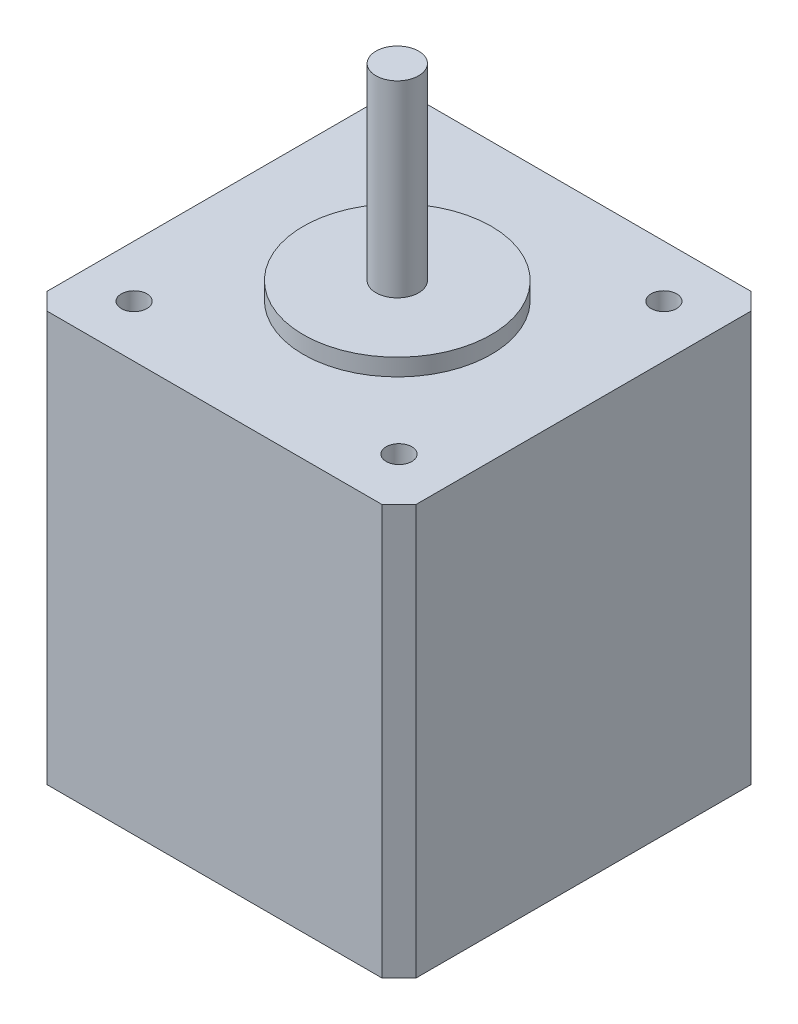
ISO-10303-21;
HEADER;
FILE_DESCRIPTION(('STEP AP214'),'2;1');
FILE_NAME('part.step','',(''),(''),'','','');
FILE_SCHEMA(('AUTOMOTIVE_DESIGN { 1 0 10303 214 1 1 1 1 }'));
ENDSEC;
DATA;
#1=APPLICATION_CONTEXT('core data for automotive mechanical design processes');
#2=APPLICATION_PROTOCOL_DEFINITION('international standard','automotive_design',2000,#1);
#3=PRODUCT_CONTEXT('',#1,'mechanical');
#4=PRODUCT('Part','Part','',(#3));
#5=PRODUCT_RELATED_PRODUCT_CATEGORY('part','',(#4));
#6=PRODUCT_DEFINITION_FORMATION('','',#4);
#7=PRODUCT_DEFINITION_CONTEXT('part definition',#1,'design');
#8=PRODUCT_DEFINITION('design','',#6,#7);
#9=PRODUCT_DEFINITION_SHAPE('','',#8);
#10=(LENGTH_UNIT() NAMED_UNIT(*) SI_UNIT(.MILLI.,.METRE.));
#11=(NAMED_UNIT(*) PLANE_ANGLE_UNIT() SI_UNIT($,.RADIAN.));
#12=(NAMED_UNIT(*) SI_UNIT($,.STERADIAN.) SOLID_ANGLE_UNIT());
#13=UNCERTAINTY_MEASURE_WITH_UNIT(LENGTH_MEASURE(1.E-05),#10,'distance_accuracy_value','');
#14=(GEOMETRIC_REPRESENTATION_CONTEXT(3) GLOBAL_UNCERTAINTY_ASSIGNED_CONTEXT((#13)) GLOBAL_UNIT_ASSIGNED_CONTEXT((#10,
#11,#12)) REPRESENTATION_CONTEXT('',''));
#15=CARTESIAN_POINT('',(0.,0.,0.));
#16=DIRECTION('',(0.,0.,1.));
#17=DIRECTION('',(1.,0.,0.));
#18=AXIS2_PLACEMENT_3D('',#15,#16,#17);
#19=CARTESIAN_POINT('',(21.4,50.,-21.6));
#20=DIRECTION('',(0.,1.,0.));
#21=DIRECTION('',(0.,0.,1.));
#22=AXIS2_PLACEMENT_3D('',#19,#20,#21);
#23=PLANE('',#22);
#24=CARTESIAN_POINT('',(21.4,50.,-21.6));
#25=DIRECTION('',(0.,1.,0.));
#26=DIRECTION('',(0.,0.,1.));
#27=AXIS2_PLACEMENT_3D('',#24,#25,#26);
#28=CIRCLE('',#27,11.);
#29=CARTESIAN_POINT('',(21.4,50.,-10.6));
#30=VERTEX_POINT('',#29);
#31=EDGE_CURVE('E209',#30,#30,#28,.T.);
#32=ORIENTED_EDGE('',*,*,#31,.T.);
#33=EDGE_LOOP('',(#32));
#34=FACE_BOUND('',#33,.T.);
#35=CARTESIAN_POINT('',(21.4,50.,-21.6));
#36=DIRECTION('',(0.,1.,0.));
#37=DIRECTION('',(0.,0.,1.));
#38=AXIS2_PLACEMENT_3D('',#35,#36,#37);
#39=CIRCLE('',#38,2.5);
#40=CARTESIAN_POINT('',(21.4,50.,-19.1));
#41=VERTEX_POINT('',#40);
#42=EDGE_CURVE('E36',#41,#41,#39,.F.);
#43=ORIENTED_EDGE('',*,*,#42,.T.);
#44=EDGE_LOOP('',(#43));
#45=FACE_BOUND('',#44,.T.);
#46=ADVANCED_FACE('F32',(#34,#45),#23,.T.);
#47=CARTESIAN_POINT('',(0.,48.,0.));
#48=DIRECTION('',(0.,-1.,0.));
#49=DIRECTION('',(0.,0.,-1.));
#50=AXIS2_PLACEMENT_3D('',#47,#48,#49);
#51=PLANE('',#50);
#52=CARTESIAN_POINT('',(6.10000000000033,48.,-6.1));
#53=DIRECTION('',(0.,1.,0.));
#54=DIRECTION('',(0.,0.,1.));
#55=AXIS2_PLACEMENT_3D('',#52,#53,#54);
#56=CIRCLE('',#55,1.5);
#57=CARTESIAN_POINT('',(6.10000000000033,48.,-4.6));
#58=VERTEX_POINT('',#57);
#59=EDGE_CURVE('E203',#58,#58,#56,.T.);
#60=ORIENTED_EDGE('',*,*,#59,.F.);
#61=EDGE_LOOP('',(#60));
#62=FACE_BOUND('',#61,.T.);
#63=CARTESIAN_POINT('',(37.1,48.,-37.1));
#64=DIRECTION('',(0.,1.,0.));
#65=DIRECTION('',(0.,0.,1.));
#66=AXIS2_PLACEMENT_3D('',#63,#64,#65);
#67=CIRCLE('',#66,1.5);
#68=CARTESIAN_POINT('',(37.1,48.,-35.6));
#69=VERTEX_POINT('',#68);
#70=EDGE_CURVE('E192',#69,#69,#67,.T.);
#71=ORIENTED_EDGE('',*,*,#70,.F.);
#72=EDGE_LOOP('',(#71));
#73=FACE_BOUND('',#72,.T.);
#74=DIRECTION('',(-1.,0.,0.));
#75=VECTOR('',#74,1.);
#76=CARTESIAN_POINT('',(0.,48.,-43.2));
#77=LINE('',#76,#75);
#78=CARTESIAN_POINT('',(41.2,48.,-43.2));
#79=VERTEX_POINT('',#78);
#80=CARTESIAN_POINT('',(2.00000000000001,48.,-43.2));
#81=VERTEX_POINT('',#80);
#82=EDGE_CURVE('E137',#79,#81,#77,.T.);
#83=ORIENTED_EDGE('',*,*,#82,.T.);
#84=DIRECTION('',(0.70710678118655,0.,-0.707106781186545));
#85=VECTOR('',#84,1.);
#86=CARTESIAN_POINT('',(0.,48.,-41.2));
#87=LINE('',#86,#85);
#88=CARTESIAN_POINT('',(0.,48.,-41.2));
#89=VERTEX_POINT('',#88);
#90=EDGE_CURVE('E156',#81,#89,#87,.F.);
#91=ORIENTED_EDGE('',*,*,#90,.T.);
#92=DIRECTION('',(0.,0.,1.));
#93=VECTOR('',#92,1.);
#94=CARTESIAN_POINT('',(0.,48.,0.));
#95=LINE('',#94,#93);
#96=CARTESIAN_POINT('',(0.,48.,-2.00000000000001));
#97=VERTEX_POINT('',#96);
#98=EDGE_CURVE('E120',#89,#97,#95,.T.);
#99=ORIENTED_EDGE('',*,*,#98,.T.);
#100=DIRECTION('',(-0.707106781186545,0.,-0.70710678118655));
#101=VECTOR('',#100,1.);
#102=CARTESIAN_POINT('',(1.99999999999999,48.,0.));
#103=LINE('',#102,#101);
#104=CARTESIAN_POINT('',(1.99999999999999,48.,0.));
#105=VERTEX_POINT('',#104);
#106=EDGE_CURVE('E151',#97,#105,#103,.F.);
#107=ORIENTED_EDGE('',*,*,#106,.T.);
#108=DIRECTION('',(1.,0.,0.));
#109=VECTOR('',#108,1.);
#110=CARTESIAN_POINT('',(0.,48.,0.));
#111=LINE('',#110,#109);
#112=CARTESIAN_POINT('',(41.2,48.,0.));
#113=VERTEX_POINT('',#112);
#114=EDGE_CURVE('E169',#105,#113,#111,.T.);
#115=ORIENTED_EDGE('',*,*,#114,.T.);
#116=DIRECTION('',(-0.70710678118655,0.,0.707106781186545));
#117=VECTOR('',#116,1.);
#118=CARTESIAN_POINT('',(43.2,48.,-1.99999999999999));
#119=LINE('',#118,#117);
#120=CARTESIAN_POINT('',(43.2,48.,-1.99999999999999));
#121=VERTEX_POINT('',#120);
#122=EDGE_CURVE('E55',#113,#121,#119,.F.);
#123=ORIENTED_EDGE('',*,*,#122,.T.);
#124=DIRECTION('',(0.,0.,-1.));
#125=VECTOR('',#124,1.);
#126=CARTESIAN_POINT('',(43.2,48.,0.));
#127=LINE('',#126,#125);
#128=CARTESIAN_POINT('',(43.2,48.,-41.2));
#129=VERTEX_POINT('',#128);
#130=EDGE_CURVE('E176',#121,#129,#127,.T.);
#131=ORIENTED_EDGE('',*,*,#130,.T.);
#132=DIRECTION('',(0.707106781186545,0.,0.70710678118655));
#133=VECTOR('',#132,1.);
#134=CARTESIAN_POINT('',(41.2,48.,-43.2));
#135=LINE('',#134,#133);
#136=EDGE_CURVE('E154',#129,#79,#135,.F.);
#137=ORIENTED_EDGE('',*,*,#136,.T.);
#138=EDGE_LOOP('',(#83,#91,#99,#107,#115,#123,#131,#137));
#139=FACE_BOUND('',#138,.T.);
#140=CARTESIAN_POINT('',(6.1,48.,-37.1));
#141=DIRECTION('',(0.,1.,0.));
#142=DIRECTION('',(0.,0.,1.));
#143=AXIS2_PLACEMENT_3D('',#140,#141,#142);
#144=CIRCLE('',#143,1.5);
#145=CARTESIAN_POINT('',(6.1,48.,-35.6));
#146=VERTEX_POINT('',#145);
#147=EDGE_CURVE('E128',#146,#146,#144,.T.);
#148=ORIENTED_EDGE('',*,*,#147,.F.);
#149=EDGE_LOOP('',(#148));
#150=FACE_BOUND('',#149,.T.);
#151=CARTESIAN_POINT('',(37.1000000000003,48.,-6.1));
#152=DIRECTION('',(0.,1.,0.));
#153=DIRECTION('',(0.,0.,1.));
#154=AXIS2_PLACEMENT_3D('',#151,#152,#153);
#155=CIRCLE('',#154,1.5);
#156=CARTESIAN_POINT('',(37.1000000000003,48.,-4.6));
#157=VERTEX_POINT('',#156);
#158=EDGE_CURVE('E197',#157,#157,#155,.T.);
#159=ORIENTED_EDGE('',*,*,#158,.F.);
#160=EDGE_LOOP('',(#159));
#161=FACE_BOUND('',#160,.T.);
#162=CARTESIAN_POINT('',(21.4,48.,-21.6));
#163=DIRECTION('',(0.,-1.,0.));
#164=DIRECTION('',(0.,0.,-1.));
#165=AXIS2_PLACEMENT_3D('',#162,#163,#164);
#166=CIRCLE('',#165,11.);
#167=CARTESIAN_POINT('',(21.4,48.,-32.6));
#168=VERTEX_POINT('',#167);
#169=EDGE_CURVE('E11',#168,#168,#166,.F.);
#170=ORIENTED_EDGE('',*,*,#169,.F.);
#171=EDGE_LOOP('',(#170));
#172=FACE_BOUND('',#171,.T.);
#173=ADVANCED_FACE('F173',(#62,#73,#139,#150,#161,#172),#51,.F.);
#174=CARTESIAN_POINT('',(0.,0.,0.));
#175=DIRECTION('',(0.,-1.,0.));
#176=DIRECTION('',(0.,0.,-1.));
#177=AXIS2_PLACEMENT_3D('',#174,#175,#176);
#178=PLANE('',#177);
#179=CARTESIAN_POINT('',(37.1000000000003,0.,-6.1));
#180=DIRECTION('',(0.,1.,0.));
#181=DIRECTION('',(0.,0.,1.));
#182=AXIS2_PLACEMENT_3D('',#179,#180,#181);
#183=CIRCLE('',#182,1.5);
#184=CARTESIAN_POINT('',(37.1000000000003,0.,-4.6));
#185=VERTEX_POINT('',#184);
#186=EDGE_CURVE('E200',#185,#185,#183,.T.);
#187=ORIENTED_EDGE('',*,*,#186,.T.);
#188=EDGE_LOOP('',(#187));
#189=FACE_BOUND('',#188,.T.);
#190=CARTESIAN_POINT('',(6.1,0.,-37.1));
#191=DIRECTION('',(0.,1.,0.));
#192=DIRECTION('',(0.,0.,1.));
#193=AXIS2_PLACEMENT_3D('',#190,#191,#192);
#194=CIRCLE('',#193,1.5);
#195=CARTESIAN_POINT('',(6.1,0.,-35.6));
#196=VERTEX_POINT('',#195);
#197=EDGE_CURVE('E134',#196,#196,#194,.T.);
#198=ORIENTED_EDGE('',*,*,#197,.T.);
#199=EDGE_LOOP('',(#198));
#200=FACE_BOUND('',#199,.T.);
#201=DIRECTION('',(0.,0.,1.));
#202=VECTOR('',#201,1.);
#203=CARTESIAN_POINT('',(0.,0.,0.));
#204=LINE('',#203,#202);
#205=CARTESIAN_POINT('',(0.,0.,-41.2));
#206=VERTEX_POINT('',#205);
#207=CARTESIAN_POINT('',(0.,0.,-2.00000000000001));
#208=VERTEX_POINT('',#207);
#209=EDGE_CURVE('E117',#206,#208,#204,.T.);
#210=ORIENTED_EDGE('',*,*,#209,.F.);
#211=DIRECTION('',(-0.70710678118655,0.,0.707106781186545));
#212=VECTOR('',#211,1.);
#213=CARTESIAN_POINT('',(-20.6,0.,-20.6000000000001));
#214=LINE('',#213,#212);
#215=CARTESIAN_POINT('',(2.00000000000001,0.,-43.2));
#216=VERTEX_POINT('',#215);
#217=EDGE_CURVE('E100',#206,#216,#214,.F.);
#218=ORIENTED_EDGE('',*,*,#217,.T.);
#219=DIRECTION('',(-1.,0.,0.));
#220=VECTOR('',#219,1.);
#221=CARTESIAN_POINT('',(0.,0.,-43.2));
#222=LINE('',#221,#220);
#223=CARTESIAN_POINT('',(41.2,0.,-43.2));
#224=VERTEX_POINT('',#223);
#225=EDGE_CURVE('E141',#224,#216,#222,.T.);
#226=ORIENTED_EDGE('',*,*,#225,.F.);
#227=DIRECTION('',(-0.707106781186545,0.,-0.70710678118655));
#228=VECTOR('',#227,1.);
#229=CARTESIAN_POINT('',(42.2000000000001,0.,-42.1999999999998));
#230=LINE('',#229,#228);
#231=CARTESIAN_POINT('',(43.2,0.,-41.2));
#232=VERTEX_POINT('',#231);
#233=EDGE_CURVE('E111',#224,#232,#230,.F.);
#234=ORIENTED_EDGE('',*,*,#233,.T.);
#235=DIRECTION('',(0.,0.,-1.));
#236=VECTOR('',#235,1.);
#237=CARTESIAN_POINT('',(43.2,0.,0.));
#238=LINE('',#237,#236);
#239=CARTESIAN_POINT('',(43.2,0.,-2.));
#240=VERTEX_POINT('',#239);
#241=EDGE_CURVE('E131',#240,#232,#238,.T.);
#242=ORIENTED_EDGE('',*,*,#241,.F.);
#243=DIRECTION('',(0.70710678118655,0.,-0.707106781186545));
#244=VECTOR('',#243,1.);
#245=CARTESIAN_POINT('',(20.5999999999999,0.,20.6));
#246=LINE('',#245,#244);
#247=CARTESIAN_POINT('',(41.2,0.,0.));
#248=VERTEX_POINT('',#247);
#249=EDGE_CURVE('E145',#240,#248,#246,.F.);
#250=ORIENTED_EDGE('',*,*,#249,.T.);
#251=DIRECTION('',(1.,0.,0.));
#252=VECTOR('',#251,1.);
#253=CARTESIAN_POINT('',(0.,0.,0.));
#254=LINE('',#253,#252);
#255=CARTESIAN_POINT('',(1.99999999999999,0.,0.));
#256=VERTEX_POINT('',#255);
#257=EDGE_CURVE('E127',#256,#248,#254,.T.);
#258=ORIENTED_EDGE('',*,*,#257,.F.);
#259=DIRECTION('',(0.707106781186545,0.,0.70710678118655));
#260=VECTOR('',#259,1.);
#261=CARTESIAN_POINT('',(1.,0.,-0.999999999999997));
#262=LINE('',#261,#260);
#263=EDGE_CURVE('E121',#256,#208,#262,.F.);
#264=ORIENTED_EDGE('',*,*,#263,.T.);
#265=EDGE_LOOP('',(#210,#218,#226,#234,#242,#250,#258,#264));
#266=FACE_BOUND('',#265,.T.);
#267=CARTESIAN_POINT('',(37.1,0.,-37.1));
#268=DIRECTION('',(0.,1.,0.));
#269=DIRECTION('',(0.,0.,1.));
#270=AXIS2_PLACEMENT_3D('',#267,#268,#269);
#271=CIRCLE('',#270,1.5);
#272=CARTESIAN_POINT('',(37.1,0.,-35.6));
#273=VERTEX_POINT('',#272);
#274=EDGE_CURVE('E194',#273,#273,#271,.T.);
#275=ORIENTED_EDGE('',*,*,#274,.T.);
#276=EDGE_LOOP('',(#275));
#277=FACE_BOUND('',#276,.T.);
#278=CARTESIAN_POINT('',(6.10000000000033,0.,-6.1));
#279=DIRECTION('',(0.,1.,0.));
#280=DIRECTION('',(0.,0.,1.));
#281=AXIS2_PLACEMENT_3D('',#278,#279,#280);
#282=CIRCLE('',#281,1.5);
#283=CARTESIAN_POINT('',(6.10000000000033,0.,-4.6));
#284=VERTEX_POINT('',#283);
#285=EDGE_CURVE('E206',#284,#284,#282,.T.);
#286=ORIENTED_EDGE('',*,*,#285,.T.);
#287=EDGE_LOOP('',(#286));
#288=FACE_BOUND('',#287,.T.);
#289=ADVANCED_FACE('F124',(#189,#200,#266,#277,#288),#178,.T.);
#290=CARTESIAN_POINT('',(0.,48.,0.));
#291=DIRECTION('',(1.,0.,0.));
#292=DIRECTION('',(0.,0.,-1.));
#293=AXIS2_PLACEMENT_3D('',#290,#291,#292);
#294=PLANE('',#293);
#295=ORIENTED_EDGE('',*,*,#98,.F.);
#296=DIRECTION('',(0.,-1.,0.));
#297=VECTOR('',#296,1.);
#298=CARTESIAN_POINT('',(0.,48.,-41.2));
#299=LINE('',#298,#297);
#300=EDGE_CURVE('E104',#89,#206,#299,.T.);
#301=ORIENTED_EDGE('',*,*,#300,.T.);
#302=ORIENTED_EDGE('',*,*,#209,.T.);
#303=DIRECTION('',(0.,1.,0.));
#304=VECTOR('',#303,1.);
#305=CARTESIAN_POINT('',(0.,48.,-2.00000000000001));
#306=LINE('',#305,#304);
#307=EDGE_CURVE('E122',#208,#97,#306,.T.);
#308=ORIENTED_EDGE('',*,*,#307,.T.);
#309=EDGE_LOOP('',(#295,#301,#302,#308));
#310=FACE_BOUND('',#309,.T.);
#311=ADVANCED_FACE('F116',(#310),#294,.F.);
#312=CARTESIAN_POINT('',(0.,48.,0.));
#313=DIRECTION('',(0.,0.,-1.));
#314=DIRECTION('',(-1.,0.,0.));
#315=AXIS2_PLACEMENT_3D('',#312,#313,#314);
#316=PLANE('',#315);
#317=ORIENTED_EDGE('',*,*,#257,.T.);
#318=DIRECTION('',(0.,1.,0.));
#319=VECTOR('',#318,1.);
#320=CARTESIAN_POINT('',(41.2,48.,0.));
#321=LINE('',#320,#319);
#322=EDGE_CURVE('E41',#248,#113,#321,.T.);
#323=ORIENTED_EDGE('',*,*,#322,.T.);
#324=ORIENTED_EDGE('',*,*,#114,.F.);
#325=DIRECTION('',(0.,-1.,0.));
#326=VECTOR('',#325,1.);
#327=CARTESIAN_POINT('',(1.99999999999999,48.,0.));
#328=LINE('',#327,#326);
#329=EDGE_CURVE('E162',#105,#256,#328,.T.);
#330=ORIENTED_EDGE('',*,*,#329,.T.);
#331=EDGE_LOOP('',(#317,#323,#324,#330));
#332=FACE_BOUND('',#331,.T.);
#333=ADVANCED_FACE('F168',(#332),#316,.F.);
#334=CARTESIAN_POINT('',(43.2,48.,0.));
#335=DIRECTION('',(-1.,0.,0.));
#336=DIRECTION('',(0.,0.,1.));
#337=AXIS2_PLACEMENT_3D('',#334,#335,#336);
#338=PLANE('',#337);
#339=ORIENTED_EDGE('',*,*,#241,.T.);
#340=DIRECTION('',(0.,1.,0.));
#341=VECTOR('',#340,1.);
#342=CARTESIAN_POINT('',(43.2,48.,-41.2));
#343=LINE('',#342,#341);
#344=EDGE_CURVE('E48',#232,#129,#343,.T.);
#345=ORIENTED_EDGE('',*,*,#344,.T.);
#346=ORIENTED_EDGE('',*,*,#130,.F.);
#347=DIRECTION('',(0.,-1.,0.));
#348=VECTOR('',#347,1.);
#349=CARTESIAN_POINT('',(43.2,48.,-1.99999999999999));
#350=LINE('',#349,#348);
#351=EDGE_CURVE('E158',#121,#240,#350,.T.);
#352=ORIENTED_EDGE('',*,*,#351,.T.);
#353=EDGE_LOOP('',(#339,#345,#346,#352));
#354=FACE_BOUND('',#353,.T.);
#355=ADVANCED_FACE('F181',(#354),#338,.F.);
#356=CARTESIAN_POINT('',(0.,48.,-43.2));
#357=DIRECTION('',(0.,0.,1.));
#358=DIRECTION('',(1.,0.,0.));
#359=AXIS2_PLACEMENT_3D('',#356,#357,#358);
#360=PLANE('',#359);
#361=ORIENTED_EDGE('',*,*,#225,.T.);
#362=DIRECTION('',(0.,1.,0.));
#363=VECTOR('',#362,1.);
#364=CARTESIAN_POINT('',(2.00000000000001,48.,-43.2));
#365=LINE('',#364,#363);
#366=EDGE_CURVE('E105',#216,#81,#365,.T.);
#367=ORIENTED_EDGE('',*,*,#366,.T.);
#368=ORIENTED_EDGE('',*,*,#82,.F.);
#369=DIRECTION('',(0.,-1.,0.));
#370=VECTOR('',#369,1.);
#371=CARTESIAN_POINT('',(41.2,48.,-43.2));
#372=LINE('',#371,#370);
#373=EDGE_CURVE('E110',#79,#224,#372,.T.);
#374=ORIENTED_EDGE('',*,*,#373,.T.);
#375=EDGE_LOOP('',(#361,#367,#368,#374));
#376=FACE_BOUND('',#375,.T.);
#377=ADVANCED_FACE('F188',(#376),#360,.F.);
#378=CARTESIAN_POINT('',(6.1,48.,-37.1));
#379=DIRECTION('',(0.,-1.,0.));
#380=DIRECTION('',(0.,0.,-1.));
#381=AXIS2_PLACEMENT_3D('',#378,#379,#380);
#382=CYLINDRICAL_SURFACE('',#381,1.5);
#383=ORIENTED_EDGE('',*,*,#147,.T.);
#384=EDGE_LOOP('',(#383));
#385=FACE_BOUND('',#384,.T.);
#386=ORIENTED_EDGE('',*,*,#197,.F.);
#387=EDGE_LOOP('',(#386));
#388=FACE_BOUND('',#387,.T.);
#389=ADVANCED_FACE('F255',(#385,#388),#382,.F.);
#390=CARTESIAN_POINT('',(37.1,48.,-37.1));
#391=DIRECTION('',(0.,-1.,0.));
#392=DIRECTION('',(0.,0.,-1.));
#393=AXIS2_PLACEMENT_3D('',#390,#391,#392);
#394=CYLINDRICAL_SURFACE('',#393,1.5);
#395=ORIENTED_EDGE('',*,*,#70,.T.);
#396=EDGE_LOOP('',(#395));
#397=FACE_BOUND('',#396,.T.);
#398=ORIENTED_EDGE('',*,*,#274,.F.);
#399=EDGE_LOOP('',(#398));
#400=FACE_BOUND('',#399,.T.);
#401=ADVANCED_FACE('F251',(#397,#400),#394,.F.);
#402=CARTESIAN_POINT('',(37.1000000000003,48.,-6.1));
#403=DIRECTION('',(0.,-1.,0.));
#404=DIRECTION('',(0.,0.,-1.));
#405=AXIS2_PLACEMENT_3D('',#402,#403,#404);
#406=CYLINDRICAL_SURFACE('',#405,1.5);
#407=ORIENTED_EDGE('',*,*,#158,.T.);
#408=EDGE_LOOP('',(#407));
#409=FACE_BOUND('',#408,.T.);
#410=ORIENTED_EDGE('',*,*,#186,.F.);
#411=EDGE_LOOP('',(#410));
#412=FACE_BOUND('',#411,.T.);
#413=ADVANCED_FACE('F247',(#409,#412),#406,.F.);
#414=CARTESIAN_POINT('',(6.10000000000033,48.,-6.1));
#415=DIRECTION('',(0.,-1.,0.));
#416=DIRECTION('',(0.,0.,-1.));
#417=AXIS2_PLACEMENT_3D('',#414,#415,#416);
#418=CYLINDRICAL_SURFACE('',#417,1.5);
#419=ORIENTED_EDGE('',*,*,#59,.T.);
#420=EDGE_LOOP('',(#419));
#421=FACE_BOUND('',#420,.T.);
#422=ORIENTED_EDGE('',*,*,#285,.F.);
#423=EDGE_LOOP('',(#422));
#424=FACE_BOUND('',#423,.T.);
#425=ADVANCED_FACE('F244',(#421,#424),#418,.F.);
#426=CARTESIAN_POINT('',(0.,48.,-41.2));
#427=DIRECTION('',(0.707106781186545,0.,0.70710678118655));
#428=DIRECTION('',(0.,-1.,0.));
#429=AXIS2_PLACEMENT_3D('',#426,#427,#428);
#430=PLANE('',#429);
#431=ORIENTED_EDGE('',*,*,#90,.F.);
#432=ORIENTED_EDGE('',*,*,#366,.F.);
#433=ORIENTED_EDGE('',*,*,#217,.F.);
#434=ORIENTED_EDGE('',*,*,#300,.F.);
#435=EDGE_LOOP('',(#431,#432,#433,#434));
#436=FACE_BOUND('',#435,.T.);
#437=ADVANCED_FACE('F103',(#436),#430,.F.);
#438=CARTESIAN_POINT('',(41.2,48.,-43.2));
#439=DIRECTION('',(-0.70710678118655,0.,0.707106781186545));
#440=DIRECTION('',(0.,-1.,0.));
#441=AXIS2_PLACEMENT_3D('',#438,#439,#440);
#442=PLANE('',#441);
#443=ORIENTED_EDGE('',*,*,#136,.F.);
#444=ORIENTED_EDGE('',*,*,#344,.F.);
#445=ORIENTED_EDGE('',*,*,#233,.F.);
#446=ORIENTED_EDGE('',*,*,#373,.F.);
#447=EDGE_LOOP('',(#443,#444,#445,#446));
#448=FACE_BOUND('',#447,.T.);
#449=ADVANCED_FACE('F185',(#448),#442,.F.);
#450=CARTESIAN_POINT('',(43.2,48.,-1.99999999999999));
#451=DIRECTION('',(-0.707106781186545,0.,-0.70710678118655));
#452=DIRECTION('',(0.,-1.,0.));
#453=AXIS2_PLACEMENT_3D('',#450,#451,#452);
#454=PLANE('',#453);
#455=ORIENTED_EDGE('',*,*,#122,.F.);
#456=ORIENTED_EDGE('',*,*,#322,.F.);
#457=ORIENTED_EDGE('',*,*,#249,.F.);
#458=ORIENTED_EDGE('',*,*,#351,.F.);
#459=EDGE_LOOP('',(#455,#456,#457,#458));
#460=FACE_BOUND('',#459,.T.);
#461=ADVANCED_FACE('F179',(#460),#454,.F.);
#462=CARTESIAN_POINT('',(1.99999999999999,48.,0.));
#463=DIRECTION('',(0.70710678118655,0.,-0.707106781186545));
#464=DIRECTION('',(0.,-1.,0.));
#465=AXIS2_PLACEMENT_3D('',#462,#463,#464);
#466=PLANE('',#465);
#467=ORIENTED_EDGE('',*,*,#106,.F.);
#468=ORIENTED_EDGE('',*,*,#307,.F.);
#469=ORIENTED_EDGE('',*,*,#263,.F.);
#470=ORIENTED_EDGE('',*,*,#329,.F.);
#471=EDGE_LOOP('',(#467,#468,#469,#470));
#472=FACE_BOUND('',#471,.T.);
#473=ADVANCED_FACE('F34',(#472),#466,.F.);
#474=CARTESIAN_POINT('',(21.4,50.,-21.6));
#475=DIRECTION('',(0.,-1.,0.));
#476=DIRECTION('',(0.,0.,-1.));
#477=AXIS2_PLACEMENT_3D('',#474,#475,#476);
#478=CYLINDRICAL_SURFACE('',#477,11.);
#479=ORIENTED_EDGE('',*,*,#31,.F.);
#480=EDGE_LOOP('',(#479));
#481=FACE_BOUND('',#480,.T.);
#482=ORIENTED_EDGE('',*,*,#169,.T.);
#483=EDGE_LOOP('',(#482));
#484=FACE_BOUND('',#483,.T.);
#485=ADVANCED_FACE('F226',(#481,#484),#478,.T.);
#486=CARTESIAN_POINT('',(21.4,72.,-21.6));
#487=DIRECTION('',(0.,-1.,0.));
#488=DIRECTION('',(0.,0.,-1.));
#489=AXIS2_PLACEMENT_3D('',#486,#487,#488);
#490=CYLINDRICAL_SURFACE('',#489,2.5);
#491=ORIENTED_EDGE('',*,*,#42,.F.);
#492=EDGE_LOOP('',(#491));
#493=FACE_BOUND('',#492,.T.);
#494=CARTESIAN_POINT('',(21.4,72.,-21.6));
#495=DIRECTION('',(0.,1.,0.));
#496=DIRECTION('',(0.,0.,1.));
#497=AXIS2_PLACEMENT_3D('',#494,#495,#496);
#498=CIRCLE('',#497,2.5);
#499=CARTESIAN_POINT('',(21.4,72.,-19.1));
#500=VERTEX_POINT('',#499);
#501=EDGE_CURVE('E214',#500,#500,#498,.T.);
#502=ORIENTED_EDGE('',*,*,#501,.F.);
#503=EDGE_LOOP('',(#502));
#504=FACE_BOUND('',#503,.T.);
#505=ADVANCED_FACE('F222',(#493,#504),#490,.T.);
#506=CARTESIAN_POINT('',(21.4,72.,-21.6));
#507=DIRECTION('',(0.,1.,0.));
#508=DIRECTION('',(0.,0.,1.));
#509=AXIS2_PLACEMENT_3D('',#506,#507,#508);
#510=PLANE('',#509);
#511=ORIENTED_EDGE('',*,*,#501,.T.);
#512=EDGE_LOOP('',(#511));
#513=FACE_BOUND('',#512,.T.);
#514=ADVANCED_FACE('F225',(#513),#510,.T.);
#515=CLOSED_SHELL('',(#46,#173,#289,#311,#333,#355,#377,#389,#401,#413,#425,#437,#449,#461,#473,
#485,#505,#514));
#516=MANIFOLD_SOLID_BREP('B2',#515);
#517=ADVANCED_BREP_SHAPE_REPRESENTATION('',(#18,#516),#14);
#518=SHAPE_DEFINITION_REPRESENTATION(#9,#517);
ENDSEC;
END-ISO-10303-21;
